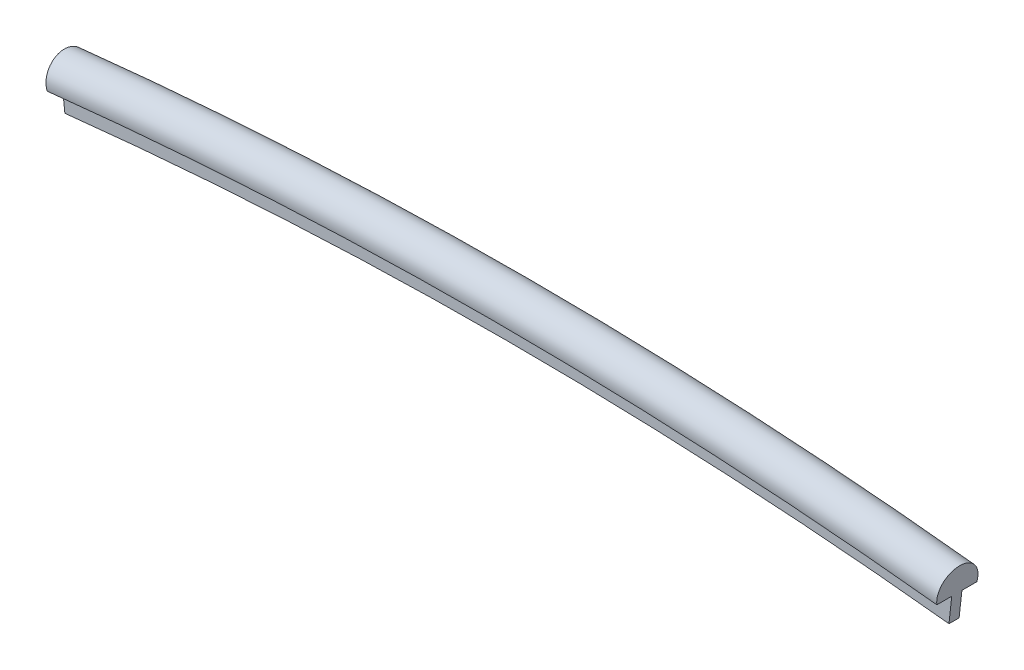
ISO-10303-21;
HEADER;
FILE_DESCRIPTION(('STEP AP214'),'2;1');
FILE_NAME('part.step','',(''),(''),'','','');
FILE_SCHEMA(('AUTOMOTIVE_DESIGN { 1 0 10303 214 1 1 1 1 }'));
ENDSEC;
DATA;
#1=APPLICATION_CONTEXT('core data for automotive mechanical design processes');
#2=APPLICATION_PROTOCOL_DEFINITION('international standard','automotive_design',2000,#1);
#3=PRODUCT_CONTEXT('',#1,'mechanical');
#4=PRODUCT('Part','Part','',(#3));
#5=PRODUCT_RELATED_PRODUCT_CATEGORY('part','',(#4));
#6=PRODUCT_DEFINITION_FORMATION('','',#4);
#7=PRODUCT_DEFINITION_CONTEXT('part definition',#1,'design');
#8=PRODUCT_DEFINITION('design','',#6,#7);
#9=PRODUCT_DEFINITION_SHAPE('','',#8);
#10=(LENGTH_UNIT() NAMED_UNIT(*) SI_UNIT(.MILLI.,.METRE.));
#11=(NAMED_UNIT(*) PLANE_ANGLE_UNIT() SI_UNIT($,.RADIAN.));
#12=(NAMED_UNIT(*) SI_UNIT($,.STERADIAN.) SOLID_ANGLE_UNIT());
#13=UNCERTAINTY_MEASURE_WITH_UNIT(LENGTH_MEASURE(1.E-05),#10,'distance_accuracy_value','');
#14=(GEOMETRIC_REPRESENTATION_CONTEXT(3) GLOBAL_UNCERTAINTY_ASSIGNED_CONTEXT((#13)) GLOBAL_UNIT_ASSIGNED_CONTEXT((#10,
#11,#12)) REPRESENTATION_CONTEXT('',''));
#15=CARTESIAN_POINT('',(0.,0.,0.));
#16=DIRECTION('',(0.,0.,1.));
#17=DIRECTION('',(1.,0.,0.));
#18=AXIS2_PLACEMENT_3D('',#15,#16,#17);
#19=CARTESIAN_POINT('',(0.,0.,70.5976415970385));
#20=DIRECTION('',(0.,0.,1.));
#21=DIRECTION('',(1.,0.,0.));
#22=AXIS2_PLACEMENT_3D('',#19,#20,#21);
#23=CYLINDRICAL_SURFACE('',#22,241.3);
#24=CARTESIAN_POINT('',(0.,0.,1.18));
#25=DIRECTION('',(0.,0.,1.));
#26=DIRECTION('',(1.,0.,0.));
#27=AXIS2_PLACEMENT_3D('',#24,#25,#26);
#28=CIRCLE('',#27,241.3);
#29=CARTESIAN_POINT('',(26.2976841346828,239.862714503844,1.18));
#30=VERTEX_POINT('',#29);
#31=CARTESIAN_POINT('',(-26.2976841346828,239.862714503844,1.18));
#32=VERTEX_POINT('',#31);
#33=EDGE_CURVE('E11',#30,#32,#28,.T.);
#34=ORIENTED_EDGE('',*,*,#33,.T.);
#35=DIRECTION('',(0.,0.,-1.));
#36=VECTOR('',#35,1.);
#37=CARTESIAN_POINT('',(-26.2976841346828,239.862714503844,1.18));
#38=LINE('',#37,#36);
#39=CARTESIAN_POINT('',(-26.2976841346828,239.862714503844,0.3));
#40=VERTEX_POINT('',#39);
#41=EDGE_CURVE('E103',#32,#40,#38,.T.);
#42=ORIENTED_EDGE('',*,*,#41,.T.);
#43=CARTESIAN_POINT('',(0.,0.,0.299999999999995));
#44=DIRECTION('',(0.,0.,1.));
#45=DIRECTION('',(1.,0.,0.));
#46=AXIS2_PLACEMENT_3D('',#43,#44,#45);
#47=CIRCLE('',#46,241.3);
#48=CARTESIAN_POINT('',(26.2976841346828,239.862714503844,0.3));
#49=VERTEX_POINT('',#48);
#50=EDGE_CURVE('E85',#49,#40,#47,.T.);
#51=ORIENTED_EDGE('',*,*,#50,.F.);
#52=DIRECTION('',(0.,0.,-1.));
#53=VECTOR('',#52,1.);
#54=CARTESIAN_POINT('',(26.2976841346828,239.862714503844,1.18));
#55=LINE('',#54,#53);
#56=EDGE_CURVE('E117',#30,#49,#55,.T.);
#57=ORIENTED_EDGE('',*,*,#56,.F.);
#58=EDGE_LOOP('',(#34,#42,#51,#57));
#59=FACE_BOUND('',#58,.T.);
#60=ADVANCED_FACE('F33',(#59),#23,.F.);
#61=CARTESIAN_POINT('',(0.,0.,0.));
#62=DIRECTION('',(0.,0.,1.));
#63=DIRECTION('',(1.,0.,0.));
#64=AXIS2_PLACEMENT_3D('',#61,#62,#63);
#65=TOROIDAL_SURFACE('',#64,241.586013989906,1.21416802890791);
#66=CARTESIAN_POINT('',(0.,0.,-1.18));
#67=DIRECTION('',(0.,0.,1.));
#68=DIRECTION('',(1.,0.,0.));
#69=AXIS2_PLACEMENT_3D('',#66,#67,#68);
#70=CIRCLE('',#69,241.3);
#71=CARTESIAN_POINT('',(26.2976841346828,239.862714503844,-1.18));
#72=VERTEX_POINT('',#71);
#73=CARTESIAN_POINT('',(-26.2976841346828,239.862714503844,-1.18));
#74=VERTEX_POINT('',#73);
#75=EDGE_CURVE('E41',#72,#74,#70,.T.);
#76=ORIENTED_EDGE('',*,*,#75,.T.);
#77=CARTESIAN_POINT('',(-26.3288548995591,240.1470248727,0.));
#78=DIRECTION('',(0.994043574404657,0.108983357375395,0.));
#79=DIRECTION('',(0.,0.,1.));
#80=AXIS2_PLACEMENT_3D('',#77,#78,#79);
#81=CIRCLE('',#80,1.21416802890791);
#82=EDGE_CURVE('E115',#74,#32,#81,.T.);
#83=ORIENTED_EDGE('',*,*,#82,.T.);
#84=ORIENTED_EDGE('',*,*,#33,.F.);
#85=CARTESIAN_POINT('',(26.3288548995591,240.1470248727,0.));
#86=DIRECTION('',(0.994043574404657,-0.108983357375395,0.));
#87=DIRECTION('',(0.,0.,1.));
#88=AXIS2_PLACEMENT_3D('',#85,#86,#87);
#89=CIRCLE('',#88,1.21416802890791);
#90=EDGE_CURVE('E97',#72,#30,#89,.T.);
#91=ORIENTED_EDGE('',*,*,#90,.F.);
#92=EDGE_LOOP('',(#76,#83,#84,#91));
#93=FACE_BOUND('',#92,.T.);
#94=ADVANCED_FACE('F35',(#93),#65,.T.);
#95=CARTESIAN_POINT('',(0.,0.,70.5976415970385));
#96=DIRECTION('',(0.,0.,1.));
#97=DIRECTION('',(1.,0.,0.));
#98=AXIS2_PLACEMENT_3D('',#95,#96,#97);
#99=CYLINDRICAL_SURFACE('',#98,241.3);
#100=CARTESIAN_POINT('',(0.,0.,-0.299999999999995));
#101=DIRECTION('',(0.,0.,1.));
#102=DIRECTION('',(1.,0.,0.));
#103=AXIS2_PLACEMENT_3D('',#100,#101,#102);
#104=CIRCLE('',#103,241.3);
#105=CARTESIAN_POINT('',(26.2976841346828,239.862714503844,-0.3));
#106=VERTEX_POINT('',#105);
#107=CARTESIAN_POINT('',(-26.2976841346828,239.862714503844,-0.3));
#108=VERTEX_POINT('',#107);
#109=EDGE_CURVE('E132',#106,#108,#104,.T.);
#110=ORIENTED_EDGE('',*,*,#109,.T.);
#111=DIRECTION('',(0.,0.,-1.));
#112=VECTOR('',#111,1.);
#113=CARTESIAN_POINT('',(-26.2976841346828,239.862714503844,-0.3));
#114=LINE('',#113,#112);
#115=EDGE_CURVE('E113',#108,#74,#114,.T.);
#116=ORIENTED_EDGE('',*,*,#115,.T.);
#117=ORIENTED_EDGE('',*,*,#75,.F.);
#118=DIRECTION('',(0.,0.,-1.));
#119=VECTOR('',#118,1.);
#120=CARTESIAN_POINT('',(26.2976841346828,239.862714503844,-0.3));
#121=LINE('',#120,#119);
#122=EDGE_CURVE('E125',#106,#72,#121,.T.);
#123=ORIENTED_EDGE('',*,*,#122,.F.);
#124=EDGE_LOOP('',(#110,#116,#117,#123));
#125=FACE_BOUND('',#124,.T.);
#126=ADVANCED_FACE('F134',(#125),#99,.F.);
#127=CARTESIAN_POINT('',(26.1342090986197,238.371649142237,-0.3));
#128=DIRECTION('',(0.,0.,1.));
#129=DIRECTION('',(1.,0.,0.));
#130=AXIS2_PLACEMENT_3D('',#127,#128,#129);
#131=PLANE('',#130);
#132=CARTESIAN_POINT('',(0.,0.,-0.299999999999995));
#133=DIRECTION('',(0.,0.,1.));
#134=DIRECTION('',(1.,0.,0.));
#135=AXIS2_PLACEMENT_3D('',#132,#133,#134);
#136=CIRCLE('',#135,239.8);
#137=CARTESIAN_POINT('',(26.1342090986197,238.371649142237,-0.3));
#138=VERTEX_POINT('',#137);
#139=CARTESIAN_POINT('',(-26.1342090986197,238.371649142237,-0.3));
#140=VERTEX_POINT('',#139);
#141=EDGE_CURVE('E129',#138,#140,#136,.T.);
#142=ORIENTED_EDGE('',*,*,#141,.T.);
#143=DIRECTION('',(-0.108983357375395,0.994043574404657,0.));
#144=VECTOR('',#143,1.);
#145=CARTESIAN_POINT('',(-26.1342090986197,238.371649142237,-0.3));
#146=LINE('',#145,#144);
#147=EDGE_CURVE('E110',#140,#108,#146,.T.);
#148=ORIENTED_EDGE('',*,*,#147,.T.);
#149=ORIENTED_EDGE('',*,*,#109,.F.);
#150=DIRECTION('',(0.108983357375395,0.994043574404657,0.));
#151=VECTOR('',#150,1.);
#152=CARTESIAN_POINT('',(26.1342090986197,238.371649142237,-0.3));
#153=LINE('',#152,#151);
#154=EDGE_CURVE('E122',#138,#106,#153,.T.);
#155=ORIENTED_EDGE('',*,*,#154,.F.);
#156=EDGE_LOOP('',(#142,#148,#149,#155));
#157=FACE_BOUND('',#156,.T.);
#158=ADVANCED_FACE('F136',(#157),#131,.F.);
#159=CARTESIAN_POINT('',(0.,0.,70.5976415970385));
#160=DIRECTION('',(0.,0.,1.));
#161=DIRECTION('',(1.,0.,0.));
#162=AXIS2_PLACEMENT_3D('',#159,#160,#161);
#163=CYLINDRICAL_SURFACE('',#162,239.8);
#164=CARTESIAN_POINT('',(0.,0.,0.299999999999995));
#165=DIRECTION('',(0.,0.,1.));
#166=DIRECTION('',(1.,0.,0.));
#167=AXIS2_PLACEMENT_3D('',#164,#165,#166);
#168=CIRCLE('',#167,239.8);
#169=CARTESIAN_POINT('',(26.1342090986197,238.371649142237,0.3));
#170=VERTEX_POINT('',#169);
#171=CARTESIAN_POINT('',(-26.1342090986197,238.371649142237,0.3));
#172=VERTEX_POINT('',#171);
#173=EDGE_CURVE('E96',#170,#172,#168,.T.);
#174=ORIENTED_EDGE('',*,*,#173,.T.);
#175=DIRECTION('',(0.,0.,-1.));
#176=VECTOR('',#175,1.);
#177=CARTESIAN_POINT('',(-26.1342090986197,238.371649142237,0.));
#178=LINE('',#177,#176);
#179=EDGE_CURVE('E105',#172,#140,#178,.T.);
#180=ORIENTED_EDGE('',*,*,#179,.T.);
#181=ORIENTED_EDGE('',*,*,#141,.F.);
#182=DIRECTION('',(0.,0.,-1.));
#183=VECTOR('',#182,1.);
#184=CARTESIAN_POINT('',(26.1342090986197,238.371649142237,0.));
#185=LINE('',#184,#183);
#186=EDGE_CURVE('E120',#170,#138,#185,.T.);
#187=ORIENTED_EDGE('',*,*,#186,.F.);
#188=EDGE_LOOP('',(#174,#180,#181,#187));
#189=FACE_BOUND('',#188,.T.);
#190=ADVANCED_FACE('F141',(#189),#163,.F.);
#191=CARTESIAN_POINT('',(26.1342090986197,238.371649142237,0.3));
#192=DIRECTION('',(0.,0.,-1.));
#193=DIRECTION('',(-1.,0.,0.));
#194=AXIS2_PLACEMENT_3D('',#191,#192,#193);
#195=PLANE('',#194);
#196=DIRECTION('',(-0.108983357375395,-0.994043574404657,0.));
#197=VECTOR('',#196,1.);
#198=CARTESIAN_POINT('',(26.1342090986197,238.371649142237,0.3));
#199=LINE('',#198,#197);
#200=EDGE_CURVE('E91',#49,#170,#199,.T.);
#201=ORIENTED_EDGE('',*,*,#200,.F.);
#202=ORIENTED_EDGE('',*,*,#50,.T.);
#203=DIRECTION('',(0.108983357375395,-0.994043574404657,0.));
#204=VECTOR('',#203,1.);
#205=CARTESIAN_POINT('',(-26.1342090986197,238.371649142237,0.3));
#206=LINE('',#205,#204);
#207=EDGE_CURVE('E88',#40,#172,#206,.T.);
#208=ORIENTED_EDGE('',*,*,#207,.T.);
#209=ORIENTED_EDGE('',*,*,#173,.F.);
#210=EDGE_LOOP('',(#201,#202,#208,#209));
#211=FACE_BOUND('',#210,.T.);
#212=ADVANCED_FACE('F87',(#211),#195,.F.);
#213=CARTESIAN_POINT('',(26.3288548995591,240.1470248727,0.));
#214=DIRECTION('',(-0.994043574404657,0.108983357375395,0.));
#215=DIRECTION('',(0.,0.,1.));
#216=AXIS2_PLACEMENT_3D('',#213,#214,#215);
#217=PLANE('',#216);
#218=ORIENTED_EDGE('',*,*,#56,.T.);
#219=ORIENTED_EDGE('',*,*,#200,.T.);
#220=ORIENTED_EDGE('',*,*,#186,.T.);
#221=ORIENTED_EDGE('',*,*,#154,.T.);
#222=ORIENTED_EDGE('',*,*,#122,.T.);
#223=ORIENTED_EDGE('',*,*,#90,.T.);
#224=EDGE_LOOP('',(#218,#219,#220,#221,#222,#223));
#225=FACE_BOUND('',#224,.T.);
#226=ADVANCED_FACE('F143',(#225),#217,.F.);
#227=CARTESIAN_POINT('',(-26.3288548995591,240.1470248727,0.));
#228=DIRECTION('',(-0.994043574404657,-0.108983357375395,0.));
#229=DIRECTION('',(0.,0.,1.));
#230=AXIS2_PLACEMENT_3D('',#227,#228,#229);
#231=PLANE('',#230);
#232=ORIENTED_EDGE('',*,*,#41,.F.);
#233=ORIENTED_EDGE('',*,*,#82,.F.);
#234=ORIENTED_EDGE('',*,*,#115,.F.);
#235=ORIENTED_EDGE('',*,*,#147,.F.);
#236=ORIENTED_EDGE('',*,*,#179,.F.);
#237=ORIENTED_EDGE('',*,*,#207,.F.);
#238=EDGE_LOOP('',(#232,#233,#234,#235,#236,#237));
#239=FACE_BOUND('',#238,.T.);
#240=ADVANCED_FACE('F101',(#239),#231,.T.);
#241=CLOSED_SHELL('',(#60,#94,#126,#158,#190,#212,#226,#240));
#242=MANIFOLD_SOLID_BREP('B2',#241);
#243=ADVANCED_BREP_SHAPE_REPRESENTATION('',(#18,#242),#14);
#244=SHAPE_DEFINITION_REPRESENTATION(#9,#243);
ENDSEC;
END-ISO-10303-21;
